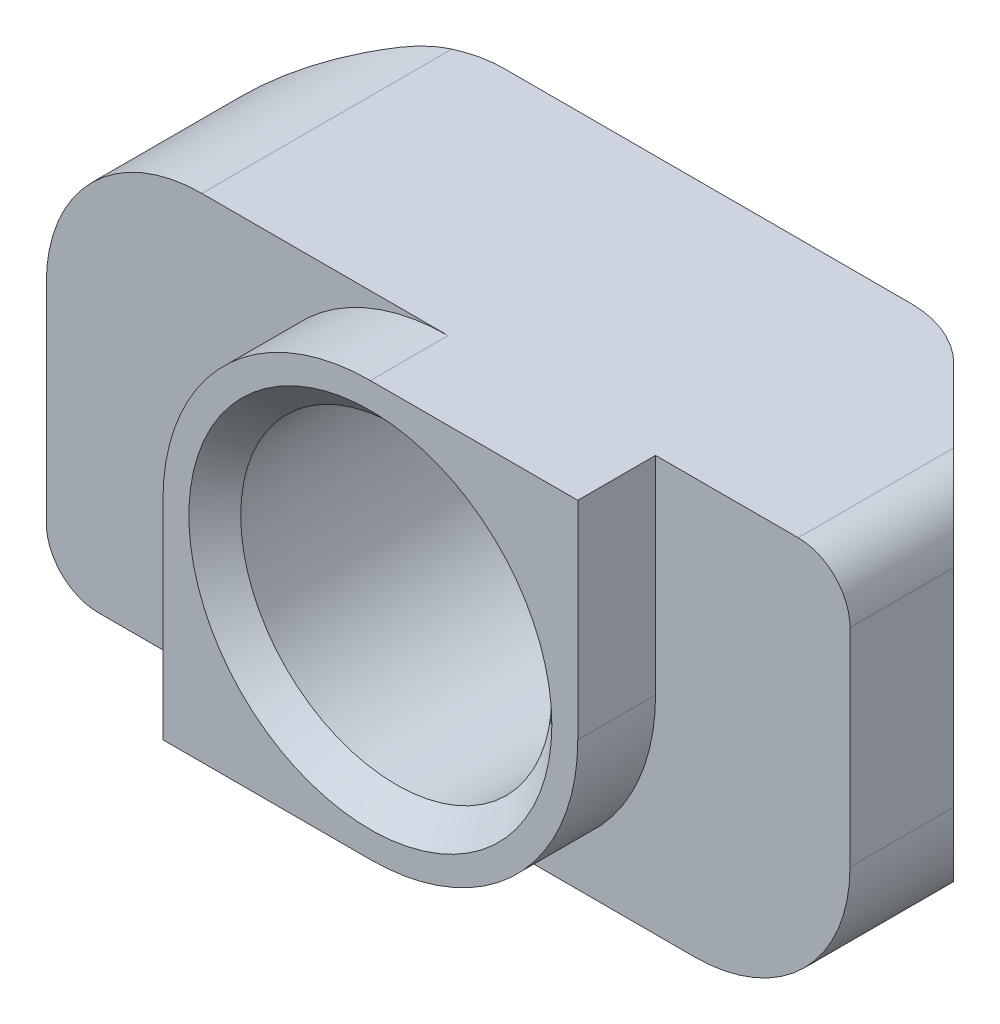
ISO-10303-21;
HEADER;
FILE_DESCRIPTION(('STEP AP214'),'2;1');
FILE_NAME('part.step','',(''),(''),'','','');
FILE_SCHEMA(('AUTOMOTIVE_DESIGN { 1 0 10303 214 1 1 1 1 }'));
ENDSEC;
DATA;
#1=APPLICATION_CONTEXT('core data for automotive mechanical design processes');
#2=APPLICATION_PROTOCOL_DEFINITION('international standard','automotive_design',2000,#1);
#3=PRODUCT_CONTEXT('',#1,'mechanical');
#4=PRODUCT('Part','Part','',(#3));
#5=PRODUCT_RELATED_PRODUCT_CATEGORY('part','',(#4));
#6=PRODUCT_DEFINITION_FORMATION('','',#4);
#7=PRODUCT_DEFINITION_CONTEXT('part definition',#1,'design');
#8=PRODUCT_DEFINITION('design','',#6,#7);
#9=PRODUCT_DEFINITION_SHAPE('','',#8);
#10=(LENGTH_UNIT() NAMED_UNIT(*) SI_UNIT(.MILLI.,.METRE.));
#11=(NAMED_UNIT(*) PLANE_ANGLE_UNIT() SI_UNIT($,.RADIAN.));
#12=(NAMED_UNIT(*) SI_UNIT($,.STERADIAN.) SOLID_ANGLE_UNIT());
#13=UNCERTAINTY_MEASURE_WITH_UNIT(LENGTH_MEASURE(1.E-05),#10,'distance_accuracy_value','');
#14=(GEOMETRIC_REPRESENTATION_CONTEXT(3) GLOBAL_UNCERTAINTY_ASSIGNED_CONTEXT((#13)) GLOBAL_UNIT_ASSIGNED_CONTEXT((#10,
#11,#12)) REPRESENTATION_CONTEXT('',''));
#15=CARTESIAN_POINT('',(0.,0.,0.));
#16=DIRECTION('',(0.,0.,1.));
#17=DIRECTION('',(1.,0.,0.));
#18=AXIS2_PLACEMENT_3D('',#15,#16,#17);
#19=CARTESIAN_POINT('',(-4.74999999991725,-4.,0.));
#20=DIRECTION('',(-0.707106781186547,0.,-0.707106781186548));
#21=DIRECTION('',(-0.707106781186548,0.,0.707106781186547));
#22=AXIS2_PLACEMENT_3D('',#19,#20,#21);
#23=PLANE('',#22);
#24=DIRECTION('',(0.,1.,0.));
#25=VECTOR('',#24,1.);
#26=CARTESIAN_POINT('',(-7.74999999991725,-4.,3.));
#27=LINE('',#26,#25);
#28=CARTESIAN_POINT('',(-7.74999999991725,-3.,3.));
#29=VERTEX_POINT('',#28);
#30=CARTESIAN_POINT('',(-7.74999999991725,1.,3.));
#31=VERTEX_POINT('',#30);
#32=EDGE_CURVE('E218',#29,#31,#27,.T.);
#33=ORIENTED_EDGE('',*,*,#32,.T.);
#34=CARTESIAN_POINT('',(-4.74999999991725,1.,0.));
#35=DIRECTION('',(-0.707106781186547,0.,-0.707106781186548));
#36=DIRECTION('',(0.707106781186548,0.,-0.707106781186547));
#37=AXIS2_PLACEMENT_3D('',#34,#35,#36);
#38=ELLIPSE('',#37,4.24264068711928,3.);
#39=CARTESIAN_POINT('',(-5.33578643754416,3.94225326059678,0.585786437626905));
#40=VERTEX_POINT('',#39);
#41=EDGE_CURVE('E319',#31,#40,#38,.T.);
#42=ORIENTED_EDGE('',*,*,#41,.T.);
#43=DIRECTION('',(0.,1.,0.));
#44=VECTOR('',#43,1.);
#45=CARTESIAN_POINT('',(-5.33578643754416,-4.,0.585786437626905));
#46=LINE('',#45,#44);
#47=CARTESIAN_POINT('',(-5.33578643754416,-4.,0.585786437626905));
#48=VERTEX_POINT('',#47);
#49=EDGE_CURVE('E277',#40,#48,#46,.F.);
#50=ORIENTED_EDGE('',*,*,#49,.T.);
#51=DIRECTION('',(-0.707106781186548,0.,0.707106781186547));
#52=VECTOR('',#51,1.);
#53=CARTESIAN_POINT('',(-4.74999999991725,-4.,0.));
#54=LINE('',#53,#52);
#55=CARTESIAN_POINT('',(-6.74999999991725,-4.,2.));
#56=VERTEX_POINT('',#55);
#57=EDGE_CURVE('E211',#48,#56,#54,.T.);
#58=ORIENTED_EDGE('',*,*,#57,.T.);
#59=CARTESIAN_POINT('',(-6.74999999991725,-3.,2.));
#60=DIRECTION('',(-0.707106781186547,0.,-0.707106781186548));
#61=DIRECTION('',(-0.707106781186548,0.,0.707106781186547));
#62=AXIS2_PLACEMENT_3D('',#59,#60,#61);
#63=ELLIPSE('',#62,1.41421356237309,1.);
#64=EDGE_CURVE('E248',#56,#29,#63,.T.);
#65=ORIENTED_EDGE('',*,*,#64,.T.);
#66=EDGE_LOOP('',(#33,#42,#50,#58,#65));
#67=FACE_BOUND('',#66,.T.);
#68=ADVANCED_FACE('F39',(#67),#23,.T.);
#69=CARTESIAN_POINT('',(4.75000000008275,-4.,0.));
#70=DIRECTION('',(0.,0.,-1.));
#71=DIRECTION('',(-1.,0.,0.));
#72=AXIS2_PLACEMENT_3D('',#69,#70,#71);
#73=PLANE('',#72);
#74=CARTESIAN_POINT('',(0.,0.,0.));
#75=DIRECTION('',(0.,0.,-1.));
#76=DIRECTION('',(-1.,0.,0.));
#77=AXIS2_PLACEMENT_3D('',#74,#75,#76);
#78=CIRCLE('',#77,3.49999999993132);
#79=CARTESIAN_POINT('',(-3.49999999993132,0.,0.));
#80=VERTEX_POINT('',#79);
#81=EDGE_CURVE('E237',#80,#80,#78,.F.);
#82=ORIENTED_EDGE('',*,*,#81,.T.);
#83=EDGE_LOOP('',(#82));
#84=FACE_BOUND('',#83,.T.);
#85=DIRECTION('',(-1.,0.,0.));
#86=VECTOR('',#85,1.);
#87=CARTESIAN_POINT('',(4.75000000008275,4.,0.));
#88=LINE('',#87,#86);
#89=CARTESIAN_POINT('',(3.92157287533656,4.,0.));
#90=VERTEX_POINT('',#89);
#91=CARTESIAN_POINT('',(-3.92157287517106,4.,0.));
#92=VERTEX_POINT('',#91);
#93=EDGE_CURVE('E214',#90,#92,#88,.T.);
#94=ORIENTED_EDGE('',*,*,#93,.F.);
#95=DIRECTION('',(0.,1.,0.));
#96=VECTOR('',#95,1.);
#97=CARTESIAN_POINT('',(3.92157287533656,-4.,0.));
#98=LINE('',#97,#96);
#99=CARTESIAN_POINT('',(3.92157287533656,-4.,0.));
#100=VERTEX_POINT('',#99);
#101=EDGE_CURVE('E270',#90,#100,#98,.F.);
#102=ORIENTED_EDGE('',*,*,#101,.T.);
#103=DIRECTION('',(-1.,0.,0.));
#104=VECTOR('',#103,1.);
#105=CARTESIAN_POINT('',(4.75000000008275,-4.,0.));
#106=LINE('',#105,#104);
#107=CARTESIAN_POINT('',(-3.92157287517106,-4.,0.));
#108=VERTEX_POINT('',#107);
#109=EDGE_CURVE('E216',#100,#108,#106,.T.);
#110=ORIENTED_EDGE('',*,*,#109,.T.);
#111=DIRECTION('',(0.,1.,0.));
#112=VECTOR('',#111,1.);
#113=CARTESIAN_POINT('',(-3.92157287517106,-4.,0.));
#114=LINE('',#113,#112);
#115=EDGE_CURVE('E267',#108,#92,#114,.T.);
#116=ORIENTED_EDGE('',*,*,#115,.T.);
#117=EDGE_LOOP('',(#94,#102,#110,#116));
#118=FACE_BOUND('',#117,.T.);
#119=ADVANCED_FACE('F387',(#84,#118),#73,.T.);
#120=CARTESIAN_POINT('',(7.75000000008275,-4.,3.));
#121=DIRECTION('',(0.707106781186548,0.,-0.707106781186548));
#122=DIRECTION('',(-0.707106781186548,0.,-0.707106781186548));
#123=AXIS2_PLACEMENT_3D('',#120,#121,#122);
#124=PLANE('',#123);
#125=DIRECTION('',(0.,1.,0.));
#126=VECTOR('',#125,1.);
#127=CARTESIAN_POINT('',(7.75000000008275,-4.,3.));
#128=LINE('',#127,#126);
#129=CARTESIAN_POINT('',(7.75000000008275,-0.999999999999998,3.));
#130=VERTEX_POINT('',#129);
#131=CARTESIAN_POINT('',(7.75000000008275,3.,3.));
#132=VERTEX_POINT('',#131);
#133=EDGE_CURVE('E224',#130,#132,#128,.T.);
#134=ORIENTED_EDGE('',*,*,#133,.F.);
#135=CARTESIAN_POINT('',(4.75000000008275,-0.999999999999998,0.));
#136=DIRECTION('',(0.707106781186548,0.,-0.707106781186548));
#137=DIRECTION('',(-0.707106781186548,0.,-0.707106781186548));
#138=AXIS2_PLACEMENT_3D('',#135,#136,#137);
#139=ELLIPSE('',#138,4.24264068711928,3.);
#140=CARTESIAN_POINT('',(5.33578643770966,-3.94225326059678,0.585786437626905));
#141=VERTEX_POINT('',#140);
#142=EDGE_CURVE('E282',#130,#141,#139,.T.);
#143=ORIENTED_EDGE('',*,*,#142,.T.);
#144=DIRECTION('',(0.,1.,0.));
#145=VECTOR('',#144,1.);
#146=CARTESIAN_POINT('',(5.33578643770966,-4.,0.585786437626905));
#147=LINE('',#146,#145);
#148=CARTESIAN_POINT('',(5.33578643770966,4.,0.585786437626904));
#149=VERTEX_POINT('',#148);
#150=EDGE_CURVE('E260',#141,#149,#147,.T.);
#151=ORIENTED_EDGE('',*,*,#150,.T.);
#152=DIRECTION('',(-0.707106781186548,0.,-0.707106781186548));
#153=VECTOR('',#152,1.);
#154=CARTESIAN_POINT('',(7.75000000008275,4.,3.));
#155=LINE('',#154,#153);
#156=CARTESIAN_POINT('',(6.75000000008275,4.,2.));
#157=VERTEX_POINT('',#156);
#158=EDGE_CURVE('E174',#157,#149,#155,.T.);
#159=ORIENTED_EDGE('',*,*,#158,.F.);
#160=CARTESIAN_POINT('',(6.75000000008275,3.,2.));
#161=DIRECTION('',(0.707106781186548,0.,-0.707106781186548));
#162=DIRECTION('',(0.707106781186548,0.,0.707106781186548));
#163=AXIS2_PLACEMENT_3D('',#160,#161,#162);
#164=ELLIPSE('',#163,1.41421356237309,1.);
#165=EDGE_CURVE('E253',#157,#132,#164,.T.);
#166=ORIENTED_EDGE('',*,*,#165,.T.);
#167=EDGE_LOOP('',(#134,#143,#151,#159,#166));
#168=FACE_BOUND('',#167,.T.);
#169=ADVANCED_FACE('F373',(#168),#124,.T.);
#170=CARTESIAN_POINT('',(7.75000000008275,-4.,6.5));
#171=DIRECTION('',(1.,0.,0.));
#172=DIRECTION('',(0.,0.,-1.));
#173=AXIS2_PLACEMENT_3D('',#170,#171,#172);
#174=PLANE('',#173);
#175=DIRECTION('',(0.,-1.,0.));
#176=VECTOR('',#175,1.);
#177=CARTESIAN_POINT('',(7.75000000008275,4.,5.));
#178=LINE('',#177,#176);
#179=CARTESIAN_POINT('',(7.75000000008275,3.,5.));
#180=VERTEX_POINT('',#179);
#181=CARTESIAN_POINT('',(7.75000000008275,-0.999999999999998,5.));
#182=VERTEX_POINT('',#181);
#183=EDGE_CURVE('E194',#180,#182,#178,.T.);
#184=ORIENTED_EDGE('',*,*,#183,.T.);
#185=DIRECTION('',(0.,0.,-1.));
#186=VECTOR('',#185,1.);
#187=CARTESIAN_POINT('',(7.75000000008275,-0.999999999999998,6.5));
#188=LINE('',#187,#186);
#189=EDGE_CURVE('E279',#182,#130,#188,.T.);
#190=ORIENTED_EDGE('',*,*,#189,.T.);
#191=ORIENTED_EDGE('',*,*,#133,.T.);
#192=DIRECTION('',(0.,0.,-1.));
#193=VECTOR('',#192,1.);
#194=CARTESIAN_POINT('',(7.75000000008275,3.,5.));
#195=LINE('',#194,#193);
#196=EDGE_CURVE('E256',#132,#180,#195,.F.);
#197=ORIENTED_EDGE('',*,*,#196,.T.);
#198=EDGE_LOOP('',(#184,#190,#191,#197));
#199=FACE_BOUND('',#198,.T.);
#200=ADVANCED_FACE('F371',(#199),#174,.T.);
#201=CARTESIAN_POINT('',(-7.74999999991725,-4.,6.5));
#202=DIRECTION('',(0.,0.,1.));
#203=DIRECTION('',(1.,0.,0.));
#204=AXIS2_PLACEMENT_3D('',#201,#202,#203);
#205=PLANE('',#204);
#206=CARTESIAN_POINT('',(0.,0.,6.5));
#207=DIRECTION('',(0.,0.,1.));
#208=DIRECTION('',(1.,0.,0.));
#209=AXIS2_PLACEMENT_3D('',#206,#207,#208);
#210=CIRCLE('',#209,3.49999999987447);
#211=CARTESIAN_POINT('',(3.49999999987447,0.,6.5));
#212=VERTEX_POINT('',#211);
#213=EDGE_CURVE('E226',#212,#212,#210,.F.);
#214=ORIENTED_EDGE('',*,*,#213,.T.);
#215=EDGE_LOOP('',(#214));
#216=FACE_BOUND('',#215,.T.);
#217=DIRECTION('',(1.,0.,0.));
#218=VECTOR('',#217,1.);
#219=CARTESIAN_POINT('',(-7.74999999991725,-4.,6.5));
#220=LINE('',#219,#218);
#221=CARTESIAN_POINT('',(-4.,-4.,6.5));
#222=VERTEX_POINT('',#221);
#223=CARTESIAN_POINT('',(8.27515139745216E-11,-4.,6.5));
#224=VERTEX_POINT('',#223);
#225=EDGE_CURVE('E213',#222,#224,#220,.T.);
#226=ORIENTED_EDGE('',*,*,#225,.T.);
#227=CARTESIAN_POINT('',(8.27515139745216E-11,0.,6.5));
#228=DIRECTION('',(0.,0.,1.));
#229=DIRECTION('',(1.,0.,0.));
#230=AXIS2_PLACEMENT_3D('',#227,#228,#229);
#231=CIRCLE('',#230,4.);
#232=CARTESIAN_POINT('',(4.00000000008275,0.,6.5));
#233=VERTEX_POINT('',#232);
#234=EDGE_CURVE('E192',#224,#233,#231,.T.);
#235=ORIENTED_EDGE('',*,*,#234,.T.);
#236=DIRECTION('',(0.,-1.,0.));
#237=VECTOR('',#236,1.);
#238=CARTESIAN_POINT('',(4.00000000008275,4.,6.5));
#239=LINE('',#238,#237);
#240=CARTESIAN_POINT('',(4.00000000008275,4.,6.5));
#241=VERTEX_POINT('',#240);
#242=EDGE_CURVE('E182',#241,#233,#239,.T.);
#243=ORIENTED_EDGE('',*,*,#242,.F.);
#244=DIRECTION('',(1.,0.,0.));
#245=VECTOR('',#244,1.);
#246=CARTESIAN_POINT('',(-7.74999999991725,4.,6.5));
#247=LINE('',#246,#245);
#248=CARTESIAN_POINT('',(0.,4.,6.5));
#249=VERTEX_POINT('',#248);
#250=EDGE_CURVE('E165',#249,#241,#247,.T.);
#251=ORIENTED_EDGE('',*,*,#250,.F.);
#252=CARTESIAN_POINT('',(0.,0.,6.5));
#253=DIRECTION('',(0.,0.,1.));
#254=DIRECTION('',(1.,0.,0.));
#255=AXIS2_PLACEMENT_3D('',#252,#253,#254);
#256=CIRCLE('',#255,4.);
#257=CARTESIAN_POINT('',(-4.,0.,6.5));
#258=VERTEX_POINT('',#257);
#259=EDGE_CURVE('E324',#249,#258,#256,.T.);
#260=ORIENTED_EDGE('',*,*,#259,.T.);
#261=DIRECTION('',(0.,-1.,0.));
#262=VECTOR('',#261,1.);
#263=CARTESIAN_POINT('',(-4.,4.,6.5));
#264=LINE('',#263,#262);
#265=EDGE_CURVE('E208',#258,#222,#264,.T.);
#266=ORIENTED_EDGE('',*,*,#265,.T.);
#267=EDGE_LOOP('',(#226,#235,#243,#251,#260,#266));
#268=FACE_BOUND('',#267,.T.);
#269=ADVANCED_FACE('F190',(#216,#268),#205,.T.);
#270=CARTESIAN_POINT('',(-7.74999999991725,-4.,3.));
#271=DIRECTION('',(-1.,0.,0.));
#272=DIRECTION('',(0.,0.,1.));
#273=AXIS2_PLACEMENT_3D('',#270,#271,#272);
#274=PLANE('',#273);
#275=DIRECTION('',(0.,-1.,0.));
#276=VECTOR('',#275,1.);
#277=CARTESIAN_POINT('',(-7.74999999991725,4.,5.));
#278=LINE('',#277,#276);
#279=CARTESIAN_POINT('',(-7.74999999991725,1.,5.));
#280=VERTEX_POINT('',#279);
#281=CARTESIAN_POINT('',(-7.74999999991725,-3.,5.));
#282=VERTEX_POINT('',#281);
#283=EDGE_CURVE('E175',#280,#282,#278,.T.);
#284=ORIENTED_EDGE('',*,*,#283,.F.);
#285=DIRECTION('',(0.,0.,1.));
#286=VECTOR('',#285,1.);
#287=CARTESIAN_POINT('',(-7.74999999991725,1.,3.));
#288=LINE('',#287,#286);
#289=EDGE_CURVE('E356',#280,#31,#288,.F.);
#290=ORIENTED_EDGE('',*,*,#289,.T.);
#291=ORIENTED_EDGE('',*,*,#32,.F.);
#292=DIRECTION('',(0.,0.,1.));
#293=VECTOR('',#292,1.);
#294=CARTESIAN_POINT('',(-7.74999999991725,-3.,3.));
#295=LINE('',#294,#293);
#296=EDGE_CURVE('E240',#29,#282,#295,.T.);
#297=ORIENTED_EDGE('',*,*,#296,.T.);
#298=EDGE_LOOP('',(#284,#290,#291,#297));
#299=FACE_BOUND('',#298,.T.);
#300=ADVANCED_FACE('F354',(#299),#274,.T.);
#301=CARTESIAN_POINT('',(0.,-4.,0.));
#302=DIRECTION('',(0.,-1.,0.));
#303=DIRECTION('',(0.,0.,-1.));
#304=AXIS2_PLACEMENT_3D('',#301,#302,#303);
#305=PLANE('',#304);
#306=DIRECTION('',(1.,0.,0.));
#307=VECTOR('',#306,1.);
#308=CARTESIAN_POINT('',(4.00000000008275,-4.,5.));
#309=LINE('',#308,#307);
#310=CARTESIAN_POINT('',(8.27523813362596E-11,-4.,5.));
#311=VERTEX_POINT('',#310);
#312=CARTESIAN_POINT('',(4.75000000008275,-4.,5.));
#313=VERTEX_POINT('',#312);
#314=EDGE_CURVE('E187',#311,#313,#309,.T.);
#315=ORIENTED_EDGE('',*,*,#314,.F.);
#316=DIRECTION('',(0.,0.,-1.));
#317=VECTOR('',#316,1.);
#318=CARTESIAN_POINT('',(8.27515139745216E-11,-4.,6.5));
#319=LINE('',#318,#317);
#320=EDGE_CURVE('E322',#311,#224,#319,.F.);
#321=ORIENTED_EDGE('',*,*,#320,.T.);
#322=ORIENTED_EDGE('',*,*,#225,.F.);
#323=DIRECTION('',(0.,0.,1.));
#324=VECTOR('',#323,1.);
#325=CARTESIAN_POINT('',(-4.,-4.,5.));
#326=LINE('',#325,#324);
#327=CARTESIAN_POINT('',(-4.,-4.,5.));
#328=VERTEX_POINT('',#327);
#329=EDGE_CURVE('E201',#328,#222,#326,.T.);
#330=ORIENTED_EDGE('',*,*,#329,.F.);
#331=DIRECTION('',(1.,0.,0.));
#332=VECTOR('',#331,1.);
#333=CARTESIAN_POINT('',(-7.74999999991725,-4.,5.));
#334=LINE('',#333,#332);
#335=CARTESIAN_POINT('',(-6.74999999991725,-4.,5.));
#336=VERTEX_POINT('',#335);
#337=EDGE_CURVE('E202',#336,#328,#334,.T.);
#338=ORIENTED_EDGE('',*,*,#337,.F.);
#339=DIRECTION('',(0.,0.,1.));
#340=VECTOR('',#339,1.);
#341=CARTESIAN_POINT('',(-6.74999999991725,-4.,0.));
#342=LINE('',#341,#340);
#343=EDGE_CURVE('E245',#336,#56,#342,.F.);
#344=ORIENTED_EDGE('',*,*,#343,.T.);
#345=ORIENTED_EDGE('',*,*,#57,.F.);
#346=CARTESIAN_POINT('',(-3.92157287517106,-4.,2.));
#347=DIRECTION('',(0.,-1.,0.));
#348=DIRECTION('',(0.,0.,-1.));
#349=AXIS2_PLACEMENT_3D('',#346,#347,#348);
#350=CIRCLE('',#349,2.);
#351=EDGE_CURVE('E272',#48,#108,#350,.T.);
#352=ORIENTED_EDGE('',*,*,#351,.T.);
#353=ORIENTED_EDGE('',*,*,#109,.F.);
#354=CARTESIAN_POINT('',(3.92157287533656,-4.,2.));
#355=DIRECTION('',(0.,-1.,0.));
#356=DIRECTION('',(0.,0.,-1.));
#357=AXIS2_PLACEMENT_3D('',#354,#355,#356);
#358=CIRCLE('',#357,2.);
#359=CARTESIAN_POINT('',(4.75000000008275,-4.,0.179640557751091));
#360=VERTEX_POINT('',#359);
#361=EDGE_CURVE('E274',#100,#360,#358,.T.);
#362=ORIENTED_EDGE('',*,*,#361,.T.);
#363=DIRECTION('',(0.,0.,-1.));
#364=VECTOR('',#363,1.);
#365=CARTESIAN_POINT('',(4.75000000008275,-4.,0.));
#366=LINE('',#365,#364);
#367=EDGE_CURVE('E292',#360,#313,#366,.F.);
#368=ORIENTED_EDGE('',*,*,#367,.T.);
#369=EDGE_LOOP('',(#315,#321,#322,#330,#338,#344,#345,#352,#353,#362,#368));
#370=FACE_BOUND('',#369,.T.);
#371=ADVANCED_FACE('F337',(#370),#305,.T.);
#372=CARTESIAN_POINT('',(0.,4.,0.));
#373=DIRECTION('',(0.,-1.,0.));
#374=DIRECTION('',(0.,0.,-1.));
#375=AXIS2_PLACEMENT_3D('',#372,#373,#374);
#376=PLANE('',#375);
#377=DIRECTION('',(1.,0.,0.));
#378=VECTOR('',#377,1.);
#379=CARTESIAN_POINT('',(-7.74999999991725,4.,5.));
#380=LINE('',#379,#378);
#381=CARTESIAN_POINT('',(-4.74999999991725,4.,5.));
#382=VERTEX_POINT('',#381);
#383=CARTESIAN_POINT('',(0.,4.,5.));
#384=VERTEX_POINT('',#383);
#385=EDGE_CURVE('E62',#382,#384,#380,.T.);
#386=ORIENTED_EDGE('',*,*,#385,.T.);
#387=DIRECTION('',(0.,0.,1.));
#388=VECTOR('',#387,1.);
#389=CARTESIAN_POINT('',(0.,4.,0.));
#390=LINE('',#389,#388);
#391=EDGE_CURVE('E171',#384,#249,#390,.T.);
#392=ORIENTED_EDGE('',*,*,#391,.T.);
#393=ORIENTED_EDGE('',*,*,#250,.T.);
#394=DIRECTION('',(0.,0.,-1.));
#395=VECTOR('',#394,1.);
#396=CARTESIAN_POINT('',(4.00000000008275,4.,6.5));
#397=LINE('',#396,#395);
#398=CARTESIAN_POINT('',(4.00000000008275,4.,5.));
#399=VERTEX_POINT('',#398);
#400=EDGE_CURVE('E169',#241,#399,#397,.T.);
#401=ORIENTED_EDGE('',*,*,#400,.T.);
#402=DIRECTION('',(1.,0.,0.));
#403=VECTOR('',#402,1.);
#404=CARTESIAN_POINT('',(4.00000000008275,4.,5.));
#405=LINE('',#404,#403);
#406=CARTESIAN_POINT('',(6.75000000008275,4.,5.));
#407=VERTEX_POINT('',#406);
#408=EDGE_CURVE('E186',#399,#407,#405,.T.);
#409=ORIENTED_EDGE('',*,*,#408,.T.);
#410=DIRECTION('',(0.,0.,-1.));
#411=VECTOR('',#410,1.);
#412=CARTESIAN_POINT('',(6.75000000008275,4.,3.));
#413=LINE('',#412,#411);
#414=EDGE_CURVE('E250',#407,#157,#413,.T.);
#415=ORIENTED_EDGE('',*,*,#414,.T.);
#416=ORIENTED_EDGE('',*,*,#158,.T.);
#417=CARTESIAN_POINT('',(3.92157287533656,4.,2.));
#418=DIRECTION('',(0.,-1.,0.));
#419=DIRECTION('',(0.,0.,-1.));
#420=AXIS2_PLACEMENT_3D('',#417,#418,#419);
#421=CIRCLE('',#420,2.);
#422=EDGE_CURVE('E265',#149,#90,#421,.F.);
#423=ORIENTED_EDGE('',*,*,#422,.T.);
#424=ORIENTED_EDGE('',*,*,#93,.T.);
#425=CARTESIAN_POINT('',(-3.92157287517106,4.,2.));
#426=DIRECTION('',(0.,-1.,0.));
#427=DIRECTION('',(0.,0.,-1.));
#428=AXIS2_PLACEMENT_3D('',#425,#426,#427);
#429=CIRCLE('',#428,2.);
#430=CARTESIAN_POINT('',(-4.74999999991725,4.,0.179640557751091));
#431=VERTEX_POINT('',#430);
#432=EDGE_CURVE('E262',#92,#431,#429,.F.);
#433=ORIENTED_EDGE('',*,*,#432,.T.);
#434=DIRECTION('',(0.,0.,1.));
#435=VECTOR('',#434,1.);
#436=CARTESIAN_POINT('',(-4.74999999991725,4.,5.));
#437=LINE('',#436,#435);
#438=EDGE_CURVE('E358',#431,#382,#437,.T.);
#439=ORIENTED_EDGE('',*,*,#438,.T.);
#440=EDGE_LOOP('',(#386,#392,#393,#401,#409,#415,#416,#423,#424,#433,#439));
#441=FACE_BOUND('',#440,.T.);
#442=ADVANCED_FACE('F167',(#441),#376,.F.);
#443=CARTESIAN_POINT('',(-7.74999999991725,4.,5.));
#444=DIRECTION('',(0.,0.,-1.));
#445=DIRECTION('',(-1.,0.,0.));
#446=AXIS2_PLACEMENT_3D('',#443,#444,#445);
#447=PLANE('',#446);
#448=ORIENTED_EDGE('',*,*,#385,.F.);
#449=CARTESIAN_POINT('',(-4.74999999991725,1.,5.));
#450=DIRECTION('',(0.,0.,-1.));
#451=DIRECTION('',(-1.,0.,0.));
#452=AXIS2_PLACEMENT_3D('',#449,#450,#451);
#453=CIRCLE('',#452,3.);
#454=EDGE_CURVE('E357',#382,#280,#453,.F.);
#455=ORIENTED_EDGE('',*,*,#454,.T.);
#456=ORIENTED_EDGE('',*,*,#283,.T.);
#457=CARTESIAN_POINT('',(-6.74999999991725,-3.,5.));
#458=DIRECTION('',(0.,0.,-1.));
#459=DIRECTION('',(-1.,0.,0.));
#460=AXIS2_PLACEMENT_3D('',#457,#458,#459);
#461=CIRCLE('',#460,1.);
#462=EDGE_CURVE('E243',#282,#336,#461,.F.);
#463=ORIENTED_EDGE('',*,*,#462,.T.);
#464=ORIENTED_EDGE('',*,*,#337,.T.);
#465=DIRECTION('',(0.,-1.,0.));
#466=VECTOR('',#465,1.);
#467=CARTESIAN_POINT('',(-4.,4.,5.));
#468=LINE('',#467,#466);
#469=CARTESIAN_POINT('',(-4.,0.,5.));
#470=VERTEX_POINT('',#469);
#471=EDGE_CURVE('E200',#470,#328,#468,.T.);
#472=ORIENTED_EDGE('',*,*,#471,.F.);
#473=CARTESIAN_POINT('',(0.,0.,5.));
#474=DIRECTION('',(0.,0.,-1.));
#475=DIRECTION('',(-1.,0.,0.));
#476=AXIS2_PLACEMENT_3D('',#473,#474,#475);
#477=CIRCLE('',#476,4.);
#478=EDGE_CURVE('E11',#470,#384,#477,.T.);
#479=ORIENTED_EDGE('',*,*,#478,.T.);
#480=EDGE_LOOP('',(#448,#455,#456,#463,#464,#472,#479));
#481=FACE_BOUND('',#480,.T.);
#482=ADVANCED_FACE('F511',(#481),#447,.F.);
#483=CARTESIAN_POINT('',(-4.,4.,5.));
#484=DIRECTION('',(1.,0.,0.));
#485=DIRECTION('',(0.,0.,-1.));
#486=AXIS2_PLACEMENT_3D('',#483,#484,#485);
#487=PLANE('',#486);
#488=ORIENTED_EDGE('',*,*,#265,.F.);
#489=DIRECTION('',(0.,0.,1.));
#490=VECTOR('',#489,1.);
#491=CARTESIAN_POINT('',(-4.,0.,5.));
#492=LINE('',#491,#490);
#493=EDGE_CURVE('E54',#258,#470,#492,.F.);
#494=ORIENTED_EDGE('',*,*,#493,.T.);
#495=ORIENTED_EDGE('',*,*,#471,.T.);
#496=ORIENTED_EDGE('',*,*,#329,.T.);
#497=EDGE_LOOP('',(#488,#494,#495,#496));
#498=FACE_BOUND('',#497,.T.);
#499=ADVANCED_FACE('F339',(#498),#487,.F.);
#500=CARTESIAN_POINT('',(4.00000000008275,4.,5.));
#501=DIRECTION('',(0.,0.,-1.));
#502=DIRECTION('',(-1.,0.,0.));
#503=AXIS2_PLACEMENT_3D('',#500,#501,#502);
#504=PLANE('',#503);
#505=ORIENTED_EDGE('',*,*,#314,.T.);
#506=CARTESIAN_POINT('',(4.75000000008275,-0.999999999999998,5.));
#507=DIRECTION('',(0.,0.,-1.));
#508=DIRECTION('',(-1.,0.,0.));
#509=AXIS2_PLACEMENT_3D('',#506,#507,#508);
#510=CIRCLE('',#509,3.);
#511=EDGE_CURVE('E361',#313,#182,#510,.F.);
#512=ORIENTED_EDGE('',*,*,#511,.T.);
#513=ORIENTED_EDGE('',*,*,#183,.F.);
#514=CARTESIAN_POINT('',(6.75000000008275,3.,5.));
#515=DIRECTION('',(0.,0.,-1.));
#516=DIRECTION('',(-1.,0.,0.));
#517=AXIS2_PLACEMENT_3D('',#514,#515,#516);
#518=CIRCLE('',#517,1.);
#519=EDGE_CURVE('E258',#180,#407,#518,.F.);
#520=ORIENTED_EDGE('',*,*,#519,.T.);
#521=ORIENTED_EDGE('',*,*,#408,.F.);
#522=DIRECTION('',(0.,-1.,0.));
#523=VECTOR('',#522,1.);
#524=CARTESIAN_POINT('',(4.00000000008275,4.,5.));
#525=LINE('',#524,#523);
#526=CARTESIAN_POINT('',(4.00000000008275,0.,5.));
#527=VERTEX_POINT('',#526);
#528=EDGE_CURVE('E185',#399,#527,#525,.T.);
#529=ORIENTED_EDGE('',*,*,#528,.T.);
#530=CARTESIAN_POINT('',(8.27523813362596E-11,0.,5.));
#531=DIRECTION('',(0.,0.,-1.));
#532=DIRECTION('',(-1.,0.,0.));
#533=AXIS2_PLACEMENT_3D('',#530,#531,#532);
#534=CIRCLE('',#533,4.);
#535=EDGE_CURVE('E47',#527,#311,#534,.T.);
#536=ORIENTED_EDGE('',*,*,#535,.T.);
#537=EDGE_LOOP('',(#505,#512,#513,#520,#521,#529,#536));
#538=FACE_BOUND('',#537,.T.);
#539=ADVANCED_FACE('F332',(#538),#504,.F.);
#540=CARTESIAN_POINT('',(4.00000000008275,4.,6.5));
#541=DIRECTION('',(-1.,0.,0.));
#542=DIRECTION('',(0.,0.,1.));
#543=AXIS2_PLACEMENT_3D('',#540,#541,#542);
#544=PLANE('',#543);
#545=ORIENTED_EDGE('',*,*,#242,.T.);
#546=DIRECTION('',(0.,0.,-1.));
#547=VECTOR('',#546,1.);
#548=CARTESIAN_POINT('',(4.00000000008275,0.,5.));
#549=LINE('',#548,#547);
#550=EDGE_CURVE('E318',#233,#527,#549,.T.);
#551=ORIENTED_EDGE('',*,*,#550,.T.);
#552=ORIENTED_EDGE('',*,*,#528,.F.);
#553=ORIENTED_EDGE('',*,*,#400,.F.);
#554=EDGE_LOOP('',(#545,#551,#552,#553));
#555=FACE_BOUND('',#554,.T.);
#556=ADVANCED_FACE('F180',(#555),#544,.F.);
#557=CARTESIAN_POINT('',(0.,0.,0.));
#558=DIRECTION('',(0.,0.,-1.));
#559=DIRECTION('',(-1.,0.,0.));
#560=AXIS2_PLACEMENT_3D('',#557,#558,#559);
#561=CYLINDRICAL_SURFACE('',#560,2.99999999999999);
#562=CARTESIAN_POINT('',(0.,0.,6.00000000006867));
#563=DIRECTION('',(0.,0.,1.));
#564=DIRECTION('',(1.,0.,0.));
#565=AXIS2_PLACEMENT_3D('',#562,#563,#564);
#566=CIRCLE('',#565,2.99999999999999);
#567=CARTESIAN_POINT('',(2.99999999999999,0.,6.00000000006867));
#568=VERTEX_POINT('',#567);
#569=EDGE_CURVE('E234',#568,#568,#566,.T.);
#570=ORIENTED_EDGE('',*,*,#569,.T.);
#571=EDGE_LOOP('',(#570));
#572=FACE_BOUND('',#571,.T.);
#573=CARTESIAN_POINT('',(0.,0.,0.499999999874486));
#574=DIRECTION('',(0.,0.,-1.));
#575=DIRECTION('',(-1.,0.,0.));
#576=AXIS2_PLACEMENT_3D('',#573,#574,#575);
#577=CIRCLE('',#576,2.99999999999999);
#578=CARTESIAN_POINT('',(-2.99999999999999,0.,0.499999999874486));
#579=VERTEX_POINT('',#578);
#580=EDGE_CURVE('E231',#579,#579,#577,.T.);
#581=ORIENTED_EDGE('',*,*,#580,.T.);
#582=EDGE_LOOP('',(#581));
#583=FACE_BOUND('',#582,.T.);
#584=ADVANCED_FACE('F413',(#572,#583),#561,.F.);
#585=CARTESIAN_POINT('',(0.,0.,6.5));
#586=DIRECTION('',(0.,0.,1.));
#587=DIRECTION('',(1.,0.,0.));
#588=AXIS2_PLACEMENT_3D('',#585,#586,#587);
#589=CONICAL_SURFACE('',#588,3.49999999987447,0.785398163340601);
#590=ORIENTED_EDGE('',*,*,#569,.F.);
#591=EDGE_LOOP('',(#590));
#592=FACE_BOUND('',#591,.T.);
#593=ORIENTED_EDGE('',*,*,#213,.F.);
#594=EDGE_LOOP('',(#593));
#595=FACE_BOUND('',#594,.T.);
#596=ADVANCED_FACE('F406',(#592,#595),#589,.F.);
#597=CARTESIAN_POINT('',(0.,0.,0.499999999874486));
#598=DIRECTION('',(0.,0.,-1.));
#599=DIRECTION('',(-1.,0.,0.));
#600=AXIS2_PLACEMENT_3D('',#597,#598,#599);
#601=CONICAL_SURFACE('',#600,2.99999999999999,0.785398163454296);
#602=ORIENTED_EDGE('',*,*,#81,.F.);
#603=EDGE_LOOP('',(#602));
#604=FACE_BOUND('',#603,.T.);
#605=ORIENTED_EDGE('',*,*,#580,.F.);
#606=EDGE_LOOP('',(#605));
#607=FACE_BOUND('',#606,.T.);
#608=ADVANCED_FACE('F412',(#604,#607),#601,.F.);
#609=CARTESIAN_POINT('',(-6.74999999991725,-3.,3.));
#610=DIRECTION('',(0.,0.,1.));
#611=DIRECTION('',(1.,0.,0.));
#612=AXIS2_PLACEMENT_3D('',#609,#610,#611);
#613=CYLINDRICAL_SURFACE('',#612,1.);
#614=ORIENTED_EDGE('',*,*,#64,.F.);
#615=ORIENTED_EDGE('',*,*,#343,.F.);
#616=ORIENTED_EDGE('',*,*,#462,.F.);
#617=ORIENTED_EDGE('',*,*,#296,.F.);
#618=EDGE_LOOP('',(#614,#615,#616,#617));
#619=FACE_BOUND('',#618,.T.);
#620=ADVANCED_FACE('F347',(#619),#613,.T.);
#621=CARTESIAN_POINT('',(6.75000000008275,3.,0.));
#622=DIRECTION('',(0.,0.,1.));
#623=DIRECTION('',(1.,0.,0.));
#624=AXIS2_PLACEMENT_3D('',#621,#622,#623);
#625=CYLINDRICAL_SURFACE('',#624,1.);
#626=ORIENTED_EDGE('',*,*,#519,.F.);
#627=ORIENTED_EDGE('',*,*,#196,.F.);
#628=ORIENTED_EDGE('',*,*,#165,.F.);
#629=ORIENTED_EDGE('',*,*,#414,.F.);
#630=EDGE_LOOP('',(#626,#627,#628,#629));
#631=FACE_BOUND('',#630,.T.);
#632=ADVANCED_FACE('F380',(#631),#625,.T.);
#633=CARTESIAN_POINT('',(3.92157287533656,-4.,2.));
#634=DIRECTION('',(0.,1.,0.));
#635=DIRECTION('',(0.,0.,1.));
#636=AXIS2_PLACEMENT_3D('',#633,#634,#635);
#637=CYLINDRICAL_SURFACE('',#636,2.);
#638=ORIENTED_EDGE('',*,*,#150,.F.);
#639=CARTESIAN_POINT('',(5.33578643770966,-3.94225326059678,0.585786437626905));
#640=CARTESIAN_POINT('',(5.29362263151523,-3.95065218175971,0.5436139215145));
#641=CARTESIAN_POINT('',(5.2494967716052,-3.95849051638954,0.503269511533735));
#642=CARTESIAN_POINT('',(5.15808080363296,-3.97247089168576,0.426927594114019));
#643=CARTESIAN_POINT('',(5.110823253822,-3.97862776240851,0.390893771105971));
#644=CARTESIAN_POINT('',(5.01311360155562,-3.98884262289005,0.323076415301191));
#645=CARTESIAN_POINT('',(4.96266099017948,-3.99290027732964,0.291293562135738));
#646=CARTESIAN_POINT('',(4.85854273768305,-3.99849594596939,0.232028830070311));
#647=CARTESIAN_POINT('',(4.80485178129214,-4.00001040684229,0.204589265223643));
#648=CARTESIAN_POINT('',(4.75000000008275,-4.,0.17964055775109));
#649=B_SPLINE_CURVE_WITH_KNOTS('',3,(#639,#640,#641,#642,#643,#644,#645,#646,#647,#648),
.UNSPECIFIED.,.F.,.F.,(4,2,2,2,4),(0.,0.180631081656942,0.359613435123769,0.538624369591326,
0.719284219274028),.UNSPECIFIED.);
#650=EDGE_CURVE('E284',#141,#360,#649,.T.);
#651=ORIENTED_EDGE('',*,*,#650,.T.);
#652=ORIENTED_EDGE('',*,*,#361,.F.);
#653=ORIENTED_EDGE('',*,*,#101,.F.);
#654=ORIENTED_EDGE('',*,*,#422,.F.);
#655=EDGE_LOOP('',(#638,#651,#652,#653,#654));
#656=FACE_BOUND('',#655,.T.);
#657=ADVANCED_FACE('F294',(#656),#637,.T.);
#658=CARTESIAN_POINT('',(-3.92157287517106,-4.,2.));
#659=DIRECTION('',(0.,1.,0.));
#660=DIRECTION('',(0.,0.,1.));
#661=AXIS2_PLACEMENT_3D('',#658,#659,#660);
#662=CYLINDRICAL_SURFACE('',#661,2.);
#663=ORIENTED_EDGE('',*,*,#49,.F.);
#664=CARTESIAN_POINT('',(-5.33578643754416,3.94225326059678,0.585786437626905));
#665=CARTESIAN_POINT('',(-5.29362263134973,3.95065218175971,0.543613921514499));
#666=CARTESIAN_POINT('',(-5.2494967714397,3.95849051638954,0.503269511533734));
#667=CARTESIAN_POINT('',(-5.15808080346746,3.97247089168577,0.426927594114019));
#668=CARTESIAN_POINT('',(-5.11082325365651,3.97862776240852,0.390893771105971));
#669=CARTESIAN_POINT('',(-5.01311360139012,3.98884262289005,0.323076415301191));
#670=CARTESIAN_POINT('',(-4.96266099001398,3.99290027732964,0.291293562135738));
#671=CARTESIAN_POINT('',(-4.85854273751755,3.9984959459694,0.232028830070311));
#672=CARTESIAN_POINT('',(-4.80485178112664,4.00001040684229,0.204589265223643));
#673=CARTESIAN_POINT('',(-4.74999999991725,4.,0.179640557751091));
#674=B_SPLINE_CURVE_WITH_KNOTS('',3,(#664,#665,#666,#667,#668,#669,#670,#671,#672,#673),
.UNSPECIFIED.,.F.,.F.,(4,2,2,2,4),(0.,0.180631081656941,0.359613435123768,0.538624369591325,
0.719284219274026),.UNSPECIFIED.);
#675=EDGE_CURVE('E311',#40,#431,#674,.T.);
#676=ORIENTED_EDGE('',*,*,#675,.T.);
#677=ORIENTED_EDGE('',*,*,#432,.F.);
#678=ORIENTED_EDGE('',*,*,#115,.F.);
#679=ORIENTED_EDGE('',*,*,#351,.F.);
#680=EDGE_LOOP('',(#663,#676,#677,#678,#679));
#681=FACE_BOUND('',#680,.T.);
#682=ADVANCED_FACE('F303',(#681),#662,.T.);
#683=CARTESIAN_POINT('',(4.75000000008275,-0.999999999999998,6.5));
#684=DIRECTION('',(0.,0.,-1.));
#685=DIRECTION('',(-1.,0.,0.));
#686=AXIS2_PLACEMENT_3D('',#683,#684,#685);
#687=CYLINDRICAL_SURFACE('',#686,3.);
#688=ORIENTED_EDGE('',*,*,#511,.F.);
#689=ORIENTED_EDGE('',*,*,#367,.F.);
#690=ORIENTED_EDGE('',*,*,#650,.F.);
#691=ORIENTED_EDGE('',*,*,#142,.F.);
#692=ORIENTED_EDGE('',*,*,#189,.F.);
#693=EDGE_LOOP('',(#688,#689,#690,#691,#692));
#694=FACE_BOUND('',#693,.T.);
#695=ADVANCED_FACE('F298',(#694),#687,.T.);
#696=CARTESIAN_POINT('',(-4.74999999991725,1.,0.));
#697=DIRECTION('',(0.,0.,-1.));
#698=DIRECTION('',(-1.,0.,0.));
#699=AXIS2_PLACEMENT_3D('',#696,#697,#698);
#700=CYLINDRICAL_SURFACE('',#699,3.);
#701=ORIENTED_EDGE('',*,*,#41,.F.);
#702=ORIENTED_EDGE('',*,*,#289,.F.);
#703=ORIENTED_EDGE('',*,*,#454,.F.);
#704=ORIENTED_EDGE('',*,*,#438,.F.);
#705=ORIENTED_EDGE('',*,*,#675,.F.);
#706=EDGE_LOOP('',(#701,#702,#703,#704,#705));
#707=FACE_BOUND('',#706,.T.);
#708=ADVANCED_FACE('F302',(#707),#700,.T.);
#709=CARTESIAN_POINT('',(8.27515139745216E-11,0.,6.5));
#710=DIRECTION('',(0.,0.,1.));
#711=DIRECTION('',(1.,0.,0.));
#712=AXIS2_PLACEMENT_3D('',#709,#710,#711);
#713=CYLINDRICAL_SURFACE('',#712,4.);
#714=ORIENTED_EDGE('',*,*,#234,.F.);
#715=ORIENTED_EDGE('',*,*,#320,.F.);
#716=ORIENTED_EDGE('',*,*,#535,.F.);
#717=ORIENTED_EDGE('',*,*,#550,.F.);
#718=EDGE_LOOP('',(#714,#715,#716,#717));
#719=FACE_BOUND('',#718,.T.);
#720=ADVANCED_FACE('F308',(#719),#713,.T.);
#721=CARTESIAN_POINT('',(0.,0.,0.));
#722=DIRECTION('',(0.,0.,1.));
#723=DIRECTION('',(1.,0.,0.));
#724=AXIS2_PLACEMENT_3D('',#721,#722,#723);
#725=CYLINDRICAL_SURFACE('',#724,4.);
#726=ORIENTED_EDGE('',*,*,#478,.F.);
#727=ORIENTED_EDGE('',*,*,#493,.F.);
#728=ORIENTED_EDGE('',*,*,#259,.F.);
#729=ORIENTED_EDGE('',*,*,#391,.F.);
#730=EDGE_LOOP('',(#726,#727,#728,#729));
#731=FACE_BOUND('',#730,.T.);
#732=ADVANCED_FACE('F41',(#731),#725,.T.);
#733=CLOSED_SHELL('',(#68,#119,#169,#200,#269,#300,#371,#442,#482,#499,#539,#556,#584,#596,#608,
#620,#632,#657,#682,#695,#708,#720,#732));
#734=MANIFOLD_SOLID_BREP('B2',#733);
#735=ADVANCED_BREP_SHAPE_REPRESENTATION('',(#18,#734),#14);
#736=SHAPE_DEFINITION_REPRESENTATION(#9,#735);
ENDSEC;
END-ISO-10303-21;
